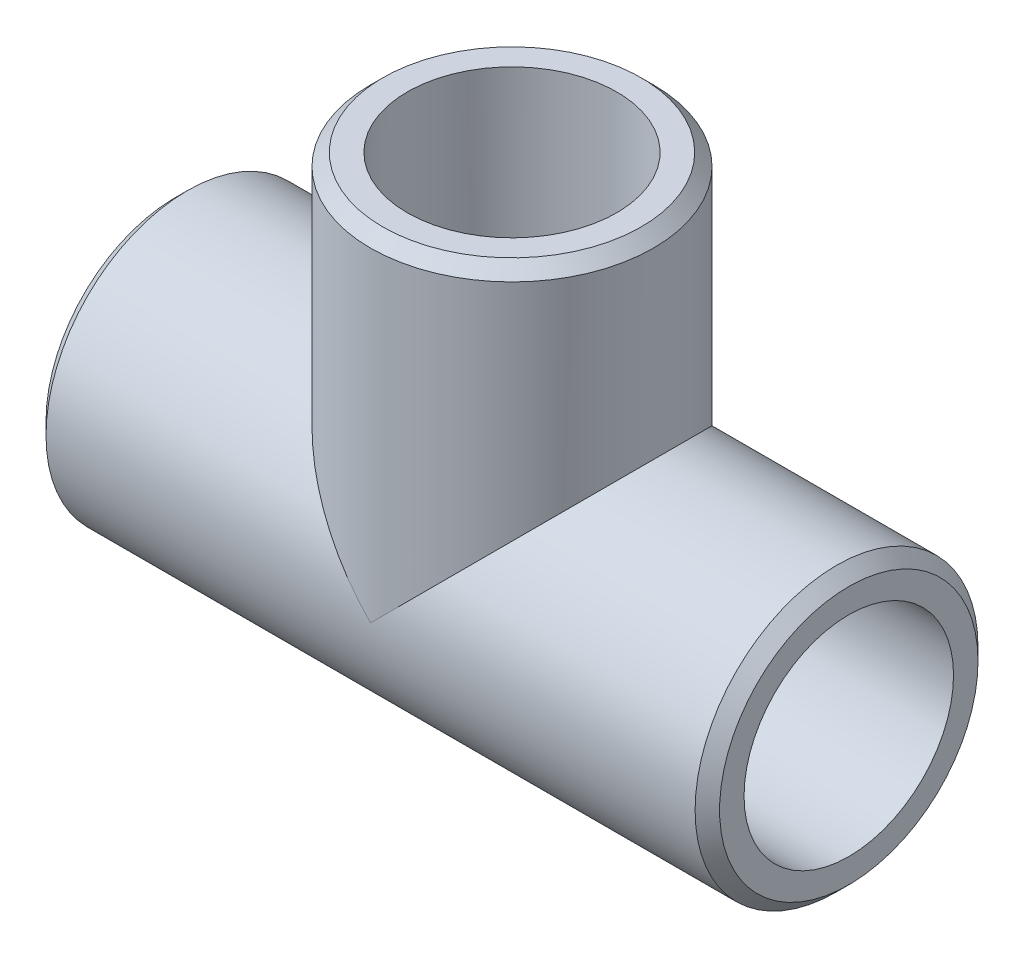
ISO-10303-21;
HEADER;
FILE_DESCRIPTION(('STEP AP214'),'2;1');
FILE_NAME('part.step','',(''),(''),'','','');
FILE_SCHEMA(('AUTOMOTIVE_DESIGN { 1 0 10303 214 1 1 1 1 }'));
ENDSEC;
DATA;
#1=APPLICATION_CONTEXT('core data for automotive mechanical design processes');
#2=APPLICATION_PROTOCOL_DEFINITION('international standard','automotive_design',2000,#1);
#3=PRODUCT_CONTEXT('',#1,'mechanical');
#4=PRODUCT('Part','Part','',(#3));
#5=PRODUCT_RELATED_PRODUCT_CATEGORY('part','',(#4));
#6=PRODUCT_DEFINITION_FORMATION('','',#4);
#7=PRODUCT_DEFINITION_CONTEXT('part definition',#1,'design');
#8=PRODUCT_DEFINITION('design','',#6,#7);
#9=PRODUCT_DEFINITION_SHAPE('','',#8);
#10=(LENGTH_UNIT() NAMED_UNIT(*) SI_UNIT(.MILLI.,.METRE.));
#11=(NAMED_UNIT(*) PLANE_ANGLE_UNIT() SI_UNIT($,.RADIAN.));
#12=(NAMED_UNIT(*) SI_UNIT($,.STERADIAN.) SOLID_ANGLE_UNIT());
#13=UNCERTAINTY_MEASURE_WITH_UNIT(LENGTH_MEASURE(1.E-05),#10,'distance_accuracy_value','');
#14=(GEOMETRIC_REPRESENTATION_CONTEXT(3) GLOBAL_UNCERTAINTY_ASSIGNED_CONTEXT((#13)) GLOBAL_UNIT_ASSIGNED_CONTEXT((#10,
#11,#12)) REPRESENTATION_CONTEXT('',''));
#15=CARTESIAN_POINT('',(0.,0.,0.));
#16=DIRECTION('',(0.,0.,1.));
#17=DIRECTION('',(1.,0.,0.));
#18=AXIS2_PLACEMENT_3D('',#15,#16,#17);
#19=CARTESIAN_POINT('',(-25.4,1.11022302462516E-13,8.88178419700125E-13));
#20=DIRECTION('',(-1.,0.,0.));
#21=DIRECTION('',(0.,0.,-1.));
#22=AXIS2_PLACEMENT_3D('',#19,#20,#21);
#23=PLANE('',#22);
#24=CARTESIAN_POINT('',(-25.4,1.11022302462516E-13,8.88178419700125E-13));
#25=DIRECTION('',(-1.,0.,0.));
#26=DIRECTION('',(0.,0.,1.));
#27=AXIS2_PLACEMENT_3D('',#24,#25,#26);
#28=CIRCLE('',#27,9.74513333333331);
#29=CARTESIAN_POINT('',(-25.4,1.11022302462516E-13,9.7451333333342));
#30=VERTEX_POINT('',#29);
#31=EDGE_CURVE('E42',#30,#30,#28,.T.);
#32=ORIENTED_EDGE('',*,*,#31,.T.);
#33=EDGE_LOOP('',(#32));
#34=FACE_BOUND('',#33,.T.);
#35=CARTESIAN_POINT('',(-25.4,1.11022302462516E-13,8.88178419700125E-13));
#36=DIRECTION('',(-1.,0.,0.));
#37=DIRECTION('',(0.,0.,1.));
#38=AXIS2_PLACEMENT_3D('',#35,#36,#37);
#39=CIRCLE('',#38,7.8994);
#40=CARTESIAN_POINT('',(-25.4,1.11022302462516E-13,7.89940000000089));
#41=VERTEX_POINT('',#40);
#42=EDGE_CURVE('E69',#41,#41,#39,.F.);
#43=ORIENTED_EDGE('',*,*,#42,.T.);
#44=EDGE_LOOP('',(#43));
#45=FACE_BOUND('',#44,.T.);
#46=ADVANCED_FACE('F34',(#34,#45),#23,.T.);
#47=CARTESIAN_POINT('',(25.4,0.,0.));
#48=DIRECTION('',(-1.,0.,0.));
#49=DIRECTION('',(0.,0.,1.));
#50=AXIS2_PLACEMENT_3D('',#47,#48,#49);
#51=CYLINDRICAL_SURFACE('',#50,10.668);
#52=CARTESIAN_POINT('',(-24.4771333333333,1.11022302462516E-13,8.88178419700125E-13));
#53=DIRECTION('',(-1.,0.,0.));
#54=DIRECTION('',(0.,0.,1.));
#55=AXIS2_PLACEMENT_3D('',#52,#53,#54);
#56=CIRCLE('',#55,10.668);
#57=CARTESIAN_POINT('',(-24.4771333333333,1.11022302462516E-13,10.6680000000009));
#58=VERTEX_POINT('',#57);
#59=EDGE_CURVE('E88',#58,#58,#56,.F.);
#60=ORIENTED_EDGE('',*,*,#59,.T.);
#61=EDGE_LOOP('',(#60));
#62=FACE_BOUND('',#61,.T.);
#63=CARTESIAN_POINT('',(24.4771333333333,0.,0.));
#64=DIRECTION('',(1.,0.,0.));
#65=DIRECTION('',(0.,0.,-1.));
#66=AXIS2_PLACEMENT_3D('',#63,#64,#65);
#67=CIRCLE('',#66,10.668);
#68=CARTESIAN_POINT('',(24.4771333333333,0.,-10.668));
#69=VERTEX_POINT('',#68);
#70=EDGE_CURVE('E85',#69,#69,#67,.F.);
#71=ORIENTED_EDGE('',*,*,#70,.T.);
#72=EDGE_LOOP('',(#71));
#73=FACE_BOUND('',#72,.T.);
#74=CARTESIAN_POINT('',(0.,0.,0.));
#75=DIRECTION('',(-0.707106781186547,-0.707106781186547,0.));
#76=DIRECTION('',(-0.707106781186547,0.707106781186547,0.));
#77=AXIS2_PLACEMENT_3D('',#74,#75,#76);
#78=ELLIPSE('',#77,15.0868302833962,10.668);
#79=CARTESIAN_POINT('',(0.,0.,-10.6679999999997));
#80=VERTEX_POINT('',#79);
#81=CARTESIAN_POINT('',(0.,0.,10.6680000000006));
#82=VERTEX_POINT('',#81);
#83=EDGE_CURVE('E51',#80,#82,#78,.F.);
#84=ORIENTED_EDGE('',*,*,#83,.F.);
#85=CARTESIAN_POINT('',(0.,0.,0.));
#86=DIRECTION('',(-0.707106781186547,0.707106781186547,0.));
#87=DIRECTION('',(-0.707106781186547,-0.707106781186547,0.));
#88=AXIS2_PLACEMENT_3D('',#85,#86,#87);
#89=ELLIPSE('',#88,15.0868302833962,10.668);
#90=EDGE_CURVE('E48',#82,#80,#89,.T.);
#91=ORIENTED_EDGE('',*,*,#90,.F.);
#92=EDGE_LOOP('',(#84,#91));
#93=FACE_BOUND('',#92,.T.);
#94=ADVANCED_FACE('F101',(#62,#73,#93),#51,.T.);
#95=CARTESIAN_POINT('',(25.4,0.,0.));
#96=DIRECTION('',(1.,0.,0.));
#97=DIRECTION('',(0.,0.,-1.));
#98=AXIS2_PLACEMENT_3D('',#95,#96,#97);
#99=PLANE('',#98);
#100=CARTESIAN_POINT('',(25.4,0.,0.));
#101=DIRECTION('',(1.,0.,0.));
#102=DIRECTION('',(0.,0.,-1.));
#103=AXIS2_PLACEMENT_3D('',#100,#101,#102);
#104=CIRCLE('',#103,9.74513333333331);
#105=CARTESIAN_POINT('',(25.4,0.,-9.74513333333331));
#106=VERTEX_POINT('',#105);
#107=EDGE_CURVE('E11',#106,#106,#104,.T.);
#108=ORIENTED_EDGE('',*,*,#107,.T.);
#109=EDGE_LOOP('',(#108));
#110=FACE_BOUND('',#109,.T.);
#111=CARTESIAN_POINT('',(25.4,0.,0.));
#112=DIRECTION('',(1.,0.,0.));
#113=DIRECTION('',(0.,0.,-1.));
#114=AXIS2_PLACEMENT_3D('',#111,#112,#113);
#115=CIRCLE('',#114,7.8994);
#116=CARTESIAN_POINT('',(25.4,0.,-7.8994));
#117=VERTEX_POINT('',#116);
#118=EDGE_CURVE('E66',#117,#117,#115,.T.);
#119=ORIENTED_EDGE('',*,*,#118,.F.);
#120=EDGE_LOOP('',(#119));
#121=FACE_BOUND('',#120,.T.);
#122=ADVANCED_FACE('F104',(#110,#121),#99,.T.);
#123=CARTESIAN_POINT('',(0.,25.4000000000001,8.88178419700125E-13));
#124=DIRECTION('',(0.,-1.,0.));
#125=DIRECTION('',(0.,0.,-1.));
#126=AXIS2_PLACEMENT_3D('',#123,#124,#125);
#127=CYLINDRICAL_SURFACE('',#126,10.668);
#128=CARTESIAN_POINT('',(0.,24.4771333333334,1.33226762955019E-12));
#129=DIRECTION('',(0.,1.,0.));
#130=DIRECTION('',(0.,0.,1.));
#131=AXIS2_PLACEMENT_3D('',#128,#129,#130);
#132=CIRCLE('',#131,10.668);
#133=CARTESIAN_POINT('',(0.,24.4771333333334,10.6680000000013));
#134=VERTEX_POINT('',#133);
#135=EDGE_CURVE('E82',#134,#134,#132,.F.);
#136=ORIENTED_EDGE('',*,*,#135,.T.);
#137=EDGE_LOOP('',(#136));
#138=FACE_BOUND('',#137,.T.);
#139=ORIENTED_EDGE('',*,*,#90,.T.);
#140=ORIENTED_EDGE('',*,*,#83,.T.);
#141=EDGE_LOOP('',(#139,#140));
#142=FACE_BOUND('',#141,.T.);
#143=ADVANCED_FACE('F114',(#138,#142),#127,.T.);
#144=CARTESIAN_POINT('',(0.,25.4000000000001,8.88178419700125E-13));
#145=DIRECTION('',(0.,1.,0.));
#146=DIRECTION('',(0.,0.,1.));
#147=AXIS2_PLACEMENT_3D('',#144,#145,#146);
#148=PLANE('',#147);
#149=CARTESIAN_POINT('',(0.,25.4000000000001,8.88178419700125E-13));
#150=DIRECTION('',(0.,1.,0.));
#151=DIRECTION('',(0.,0.,1.));
#152=AXIS2_PLACEMENT_3D('',#149,#150,#151);
#153=CIRCLE('',#152,9.74513333333331);
#154=CARTESIAN_POINT('',(0.,25.4000000000001,9.7451333333342));
#155=VERTEX_POINT('',#154);
#156=EDGE_CURVE('E79',#155,#155,#153,.T.);
#157=ORIENTED_EDGE('',*,*,#156,.T.);
#158=EDGE_LOOP('',(#157));
#159=FACE_BOUND('',#158,.T.);
#160=CARTESIAN_POINT('',(0.,25.4000000000001,8.88178419700125E-13));
#161=DIRECTION('',(0.,1.,0.));
#162=DIRECTION('',(0.,0.,1.));
#163=AXIS2_PLACEMENT_3D('',#160,#161,#162);
#164=CIRCLE('',#163,7.8994);
#165=CARTESIAN_POINT('',(0.,25.4000000000001,7.89940000000089));
#166=VERTEX_POINT('',#165);
#167=EDGE_CURVE('E73',#166,#166,#164,.T.);
#168=ORIENTED_EDGE('',*,*,#167,.F.);
#169=EDGE_LOOP('',(#168));
#170=FACE_BOUND('',#169,.T.);
#171=ADVANCED_FACE('F119',(#159,#170),#148,.T.);
#172=CARTESIAN_POINT('',(25.4,0.,0.));
#173=DIRECTION('',(-1.,0.,0.));
#174=DIRECTION('',(0.,0.,1.));
#175=AXIS2_PLACEMENT_3D('',#172,#173,#174);
#176=CYLINDRICAL_SURFACE('',#175,7.8994);
#177=ORIENTED_EDGE('',*,*,#42,.F.);
#178=EDGE_LOOP('',(#177));
#179=FACE_BOUND('',#178,.T.);
#180=ORIENTED_EDGE('',*,*,#118,.T.);
#181=EDGE_LOOP('',(#180));
#182=FACE_BOUND('',#181,.T.);
#183=CARTESIAN_POINT('',(0.,0.,0.));
#184=DIRECTION('',(-0.707106781186547,-0.707106781186547,0.));
#185=DIRECTION('',(-0.707106781186547,0.707106781186547,0.));
#186=AXIS2_PLACEMENT_3D('',#183,#184,#185);
#187=ELLIPSE('',#186,11.17143861461,7.8994);
#188=CARTESIAN_POINT('',(0.,0.,-7.89939999999967));
#189=VERTEX_POINT('',#188);
#190=CARTESIAN_POINT('',(-6.66133814775094E-13,1.11022302462516E-13,7.89940000000011));
#191=VERTEX_POINT('',#190);
#192=EDGE_CURVE('E59',#189,#191,#187,.F.);
#193=ORIENTED_EDGE('',*,*,#192,.T.);
#194=CARTESIAN_POINT('',(0.,0.,0.));
#195=DIRECTION('',(-0.707106781186547,0.707106781186547,0.));
#196=DIRECTION('',(-0.707106781186547,-0.707106781186547,0.));
#197=AXIS2_PLACEMENT_3D('',#194,#195,#196);
#198=ELLIPSE('',#197,11.17143861461,7.8994);
#199=EDGE_CURVE('E62',#191,#189,#198,.T.);
#200=ORIENTED_EDGE('',*,*,#199,.T.);
#201=EDGE_LOOP('',(#193,#200));
#202=FACE_BOUND('',#201,.T.);
#203=ADVANCED_FACE('F65',(#179,#182,#202),#176,.F.);
#204=CARTESIAN_POINT('',(0.,25.4000000000001,8.88178419700125E-13));
#205=DIRECTION('',(0.,-1.,0.));
#206=DIRECTION('',(0.,0.,-1.));
#207=AXIS2_PLACEMENT_3D('',#204,#205,#206);
#208=CYLINDRICAL_SURFACE('',#207,7.8994);
#209=ORIENTED_EDGE('',*,*,#167,.T.);
#210=EDGE_LOOP('',(#209));
#211=FACE_BOUND('',#210,.T.);
#212=ORIENTED_EDGE('',*,*,#199,.F.);
#213=ORIENTED_EDGE('',*,*,#192,.F.);
#214=EDGE_LOOP('',(#212,#213));
#215=FACE_BOUND('',#214,.T.);
#216=ADVANCED_FACE('F61',(#211,#215),#208,.F.);
#217=CARTESIAN_POINT('',(0.,25.4000000000001,8.88178419700125E-13));
#218=DIRECTION('',(0.,-1.,0.));
#219=DIRECTION('',(0.,0.,-1.));
#220=AXIS2_PLACEMENT_3D('',#217,#218,#219);
#221=CONICAL_SURFACE('',#220,9.74513333333331,0.785398163397453);
#222=ORIENTED_EDGE('',*,*,#135,.F.);
#223=EDGE_LOOP('',(#222));
#224=FACE_BOUND('',#223,.T.);
#225=ORIENTED_EDGE('',*,*,#156,.F.);
#226=EDGE_LOOP('',(#225));
#227=FACE_BOUND('',#226,.T.);
#228=ADVANCED_FACE('F98',(#224,#227),#221,.T.);
#229=CARTESIAN_POINT('',(-24.4771333333333,1.11022302462516E-13,8.88178419700125E-13));
#230=DIRECTION('',(1.,0.,0.));
#231=DIRECTION('',(0.,0.,-1.));
#232=AXIS2_PLACEMENT_3D('',#229,#230,#231);
#233=CONICAL_SURFACE('',#232,10.668,0.785398163397453);
#234=ORIENTED_EDGE('',*,*,#31,.F.);
#235=EDGE_LOOP('',(#234));
#236=FACE_BOUND('',#235,.T.);
#237=ORIENTED_EDGE('',*,*,#59,.F.);
#238=EDGE_LOOP('',(#237));
#239=FACE_BOUND('',#238,.T.);
#240=ADVANCED_FACE('F95',(#236,#239),#233,.T.);
#241=CARTESIAN_POINT('',(25.4,0.,0.));
#242=DIRECTION('',(-1.,0.,0.));
#243=DIRECTION('',(0.,0.,1.));
#244=AXIS2_PLACEMENT_3D('',#241,#242,#243);
#245=CONICAL_SURFACE('',#244,9.74513333333331,0.785398163397453);
#246=ORIENTED_EDGE('',*,*,#70,.F.);
#247=EDGE_LOOP('',(#246));
#248=FACE_BOUND('',#247,.T.);
#249=ORIENTED_EDGE('',*,*,#107,.F.);
#250=EDGE_LOOP('',(#249));
#251=FACE_BOUND('',#250,.T.);
#252=ADVANCED_FACE('F36',(#248,#251),#245,.T.);
#253=CLOSED_SHELL('',(#46,#94,#122,#143,#171,#203,#216,#228,#240,#252));
#254=MANIFOLD_SOLID_BREP('B2',#253);
#255=ADVANCED_BREP_SHAPE_REPRESENTATION('',(#18,#254),#14);
#256=SHAPE_DEFINITION_REPRESENTATION(#9,#255);
ENDSEC;
END-ISO-10303-21;
